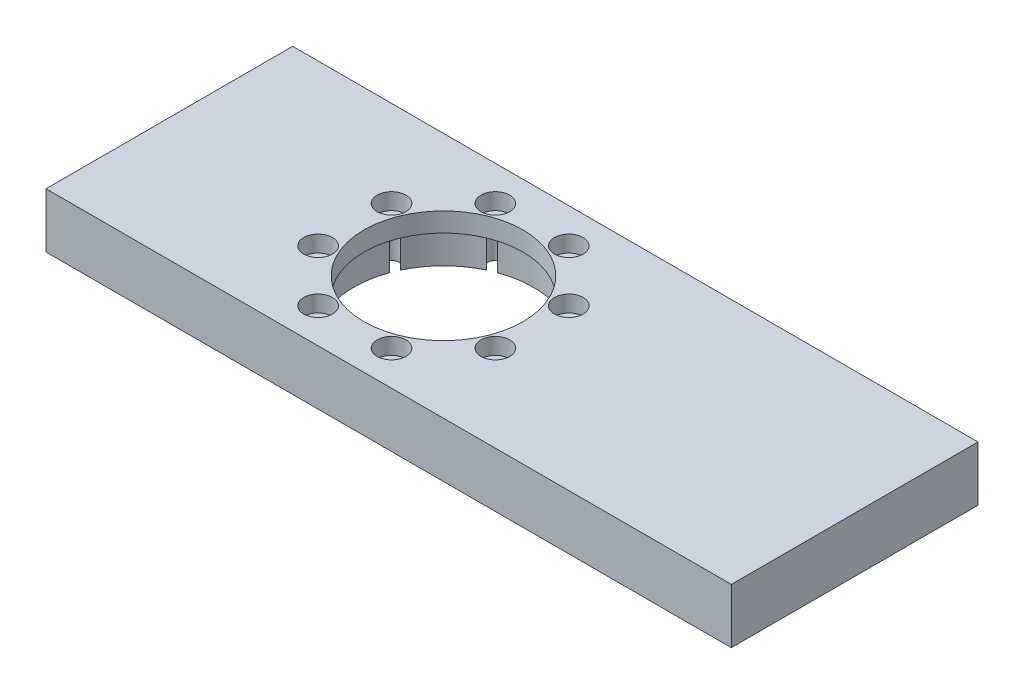
ISO-10303-21;
HEADER;
FILE_DESCRIPTION(('STEP AP214'),'2;1');
FILE_NAME('part.step','',(''),(''),'','','');
FILE_SCHEMA(('AUTOMOTIVE_DESIGN { 1 0 10303 214 1 1 1 1 }'));
ENDSEC;
DATA;
#1=APPLICATION_CONTEXT('core data for automotive mechanical design processes');
#2=APPLICATION_PROTOCOL_DEFINITION('international standard','automotive_design',2000,#1);
#3=PRODUCT_CONTEXT('',#1,'mechanical');
#4=PRODUCT('Part','Part','',(#3));
#5=PRODUCT_RELATED_PRODUCT_CATEGORY('part','',(#4));
#6=PRODUCT_DEFINITION_FORMATION('','',#4);
#7=PRODUCT_DEFINITION_CONTEXT('part definition',#1,'design');
#8=PRODUCT_DEFINITION('design','',#6,#7);
#9=PRODUCT_DEFINITION_SHAPE('','',#8);
#10=(LENGTH_UNIT() NAMED_UNIT(*) SI_UNIT(.MILLI.,.METRE.));
#11=(NAMED_UNIT(*) PLANE_ANGLE_UNIT() SI_UNIT($,.RADIAN.));
#12=(NAMED_UNIT(*) SI_UNIT($,.STERADIAN.) SOLID_ANGLE_UNIT());
#13=UNCERTAINTY_MEASURE_WITH_UNIT(LENGTH_MEASURE(1.E-05),#10,'distance_accuracy_value','');
#14=(GEOMETRIC_REPRESENTATION_CONTEXT(3) GLOBAL_UNCERTAINTY_ASSIGNED_CONTEXT((#13)) GLOBAL_UNIT_ASSIGNED_CONTEXT((#10,
#11,#12)) REPRESENTATION_CONTEXT('',''));
#15=CARTESIAN_POINT('',(0.,0.,0.));
#16=DIRECTION('',(0.,0.,1.));
#17=DIRECTION('',(1.,0.,0.));
#18=AXIS2_PLACEMENT_3D('',#15,#16,#17);
#19=CARTESIAN_POINT('',(-32.3357836378951,20.,13.3939201327779));
#20=DIRECTION('',(0.,1.,0.));
#21=DIRECTION('',(0.,0.,1.));
#22=AXIS2_PLACEMENT_3D('',#19,#20,#21);
#23=CYLINDRICAL_SURFACE('',#22,2.75);
#24=CARTESIAN_POINT('',(-32.3357836378951,14.,13.3939201327779));
#25=DIRECTION('',(0.,1.,0.));
#26=DIRECTION('',(0.,0.,1.));
#27=AXIS2_PLACEMENT_3D('',#24,#25,#26);
#28=CIRCLE('',#27,2.75000000000001);
#29=CARTESIAN_POINT('',(-32.3357836378951,14.,16.143920132778));
#30=VERTEX_POINT('',#29);
#31=EDGE_CURVE('E248',#30,#30,#28,.T.);
#32=ORIENTED_EDGE('',*,*,#31,.T.);
#33=EDGE_LOOP('',(#32));
#34=FACE_BOUND('',#33,.T.);
#35=DIRECTION('',(0.,-1.,0.));
#36=VECTOR('',#35,1.);
#37=CARTESIAN_POINT('',(-30.8092031343509,6.5,11.1065522204826));
#38=LINE('',#37,#36);
#39=CARTESIAN_POINT('',(-30.8092031343509,13.,11.1065522204826));
#40=VERTEX_POINT('',#39);
#41=CARTESIAN_POINT('',(-30.8092031343509,0.,11.1065522204826));
#42=VERTEX_POINT('',#41);
#43=EDGE_CURVE('E395',#40,#42,#38,.T.);
#44=ORIENTED_EDGE('',*,*,#43,.F.);
#45=CARTESIAN_POINT('',(-32.3357836378951,13.,13.3939201327779));
#46=DIRECTION('',(0.,1.,0.));
#47=DIRECTION('',(0.,0.,1.));
#48=AXIS2_PLACEMENT_3D('',#45,#46,#47);
#49=CIRCLE('',#48,2.75);
#50=CARTESIAN_POINT('',(-29.6389148499592,13.,13.9318780685472));
#51=VERTEX_POINT('',#50);
#52=EDGE_CURVE('E354',#40,#51,#49,.F.);
#53=ORIENTED_EDGE('',*,*,#52,.T.);
#54=DIRECTION('',(0.,-1.,0.));
#55=VECTOR('',#54,1.);
#56=CARTESIAN_POINT('',(-29.6389148499592,6.5,13.9318780685472));
#57=LINE('',#56,#55);
#58=CARTESIAN_POINT('',(-29.6389148499592,0.,13.9318780685472));
#59=VERTEX_POINT('',#58);
#60=EDGE_CURVE('E392',#59,#51,#57,.F.);
#61=ORIENTED_EDGE('',*,*,#60,.F.);
#62=CARTESIAN_POINT('',(-32.3357836378951,0.,13.3939201327779));
#63=DIRECTION('',(0.,1.,0.));
#64=DIRECTION('',(0.,0.,1.));
#65=AXIS2_PLACEMENT_3D('',#62,#63,#64);
#66=CIRCLE('',#65,2.75);
#67=EDGE_CURVE('E252',#42,#59,#66,.T.);
#68=ORIENTED_EDGE('',*,*,#67,.F.);
#69=EDGE_LOOP('',(#44,#53,#61,#68));
#70=FACE_BOUND('',#69,.T.);
#71=ADVANCED_FACE('F39',(#34,#70),#23,.F.);
#72=CARTESIAN_POINT('',(-13.3939201327785,20.,32.3357836378946));
#73=DIRECTION('',(0.,1.,0.));
#74=DIRECTION('',(0.,0.,1.));
#75=AXIS2_PLACEMENT_3D('',#72,#73,#74);
#76=CYLINDRICAL_SURFACE('',#75,2.75);
#77=CARTESIAN_POINT('',(-13.3939201327785,14.,32.3357836378946));
#78=DIRECTION('',(0.,1.,0.));
#79=DIRECTION('',(0.,0.,1.));
#80=AXIS2_PLACEMENT_3D('',#77,#78,#79);
#81=CIRCLE('',#80,2.75000000000001);
#82=CARTESIAN_POINT('',(-13.3939201327785,14.,35.0857836378946));
#83=VERTEX_POINT('',#82);
#84=EDGE_CURVE('E234',#83,#83,#81,.T.);
#85=ORIENTED_EDGE('',*,*,#84,.T.);
#86=EDGE_LOOP('',(#85));
#87=FACE_BOUND('',#86,.T.);
#88=DIRECTION('',(0.,-1.,0.));
#89=VECTOR('',#88,1.);
#90=CARTESIAN_POINT('',(-13.9318780685483,6.5,29.6389148499588));
#91=LINE('',#90,#89);
#92=CARTESIAN_POINT('',(-13.9318780685483,13.,29.6389148499588));
#93=VERTEX_POINT('',#92);
#94=CARTESIAN_POINT('',(-13.9318780685483,0.,29.6389148499588));
#95=VERTEX_POINT('',#94);
#96=EDGE_CURVE('E389',#93,#95,#91,.T.);
#97=ORIENTED_EDGE('',*,*,#96,.F.);
#98=CARTESIAN_POINT('',(-13.3939201327785,13.,32.3357836378946));
#99=DIRECTION('',(0.,1.,0.));
#100=DIRECTION('',(0.,0.,1.));
#101=AXIS2_PLACEMENT_3D('',#98,#99,#100);
#102=CIRCLE('',#101,2.75);
#103=CARTESIAN_POINT('',(-11.1065522204828,13.,30.8092031343508));
#104=VERTEX_POINT('',#103);
#105=EDGE_CURVE('E350',#93,#104,#102,.F.);
#106=ORIENTED_EDGE('',*,*,#105,.T.);
#107=DIRECTION('',(0.,-1.,0.));
#108=VECTOR('',#107,1.);
#109=CARTESIAN_POINT('',(-11.1065522204828,6.5,30.8092031343508));
#110=LINE('',#109,#108);
#111=CARTESIAN_POINT('',(-11.1065522204828,0.,30.8092031343508));
#112=VERTEX_POINT('',#111);
#113=EDGE_CURVE('E197',#112,#104,#110,.F.);
#114=ORIENTED_EDGE('',*,*,#113,.F.);
#115=CARTESIAN_POINT('',(-13.3939201327785,0.,32.3357836378946));
#116=DIRECTION('',(0.,1.,0.));
#117=DIRECTION('',(0.,0.,1.));
#118=AXIS2_PLACEMENT_3D('',#115,#116,#117);
#119=CIRCLE('',#118,2.75);
#120=EDGE_CURVE('E210',#95,#112,#119,.T.);
#121=ORIENTED_EDGE('',*,*,#120,.F.);
#122=EDGE_LOOP('',(#97,#106,#114,#121));
#123=FACE_BOUND('',#122,.T.);
#124=ADVANCED_FACE('F524',(#87,#123),#76,.F.);
#125=CARTESIAN_POINT('',(13.3939201327774,20.,32.3357836378946));
#126=DIRECTION('',(0.,1.,0.));
#127=DIRECTION('',(0.,0.,1.));
#128=AXIS2_PLACEMENT_3D('',#125,#126,#127);
#129=CYLINDRICAL_SURFACE('',#128,2.75);
#130=CARTESIAN_POINT('',(13.3939201327774,14.,32.3357836378946));
#131=DIRECTION('',(0.,1.,0.));
#132=DIRECTION('',(0.,0.,1.));
#133=AXIS2_PLACEMENT_3D('',#130,#131,#132);
#134=CIRCLE('',#133,2.75000000000001);
#135=CARTESIAN_POINT('',(13.3939201327774,14.,35.0857836378946));
#136=VERTEX_POINT('',#135);
#137=EDGE_CURVE('E219',#136,#136,#134,.T.);
#138=ORIENTED_EDGE('',*,*,#137,.T.);
#139=EDGE_LOOP('',(#138));
#140=FACE_BOUND('',#139,.T.);
#141=DIRECTION('',(0.,-1.,0.));
#142=VECTOR('',#141,1.);
#143=CARTESIAN_POINT('',(11.1065522204813,6.5,30.8092031343513));
#144=LINE('',#143,#142);
#145=CARTESIAN_POINT('',(11.1065522204814,13.,30.8092031343513));
#146=VERTEX_POINT('',#145);
#147=CARTESIAN_POINT('',(11.1065522204814,0.,30.8092031343513));
#148=VERTEX_POINT('',#147);
#149=EDGE_CURVE('E186',#146,#148,#144,.T.);
#150=ORIENTED_EDGE('',*,*,#149,.F.);
#151=CARTESIAN_POINT('',(13.3939201327774,13.,32.3357836378946));
#152=DIRECTION('',(0.,1.,0.));
#153=DIRECTION('',(0.,0.,1.));
#154=AXIS2_PLACEMENT_3D('',#151,#152,#153);
#155=CIRCLE('',#154,2.75);
#156=CARTESIAN_POINT('',(13.9318780685479,13.,29.6389148499589));
#157=VERTEX_POINT('',#156);
#158=EDGE_CURVE('E347',#146,#157,#155,.F.);
#159=ORIENTED_EDGE('',*,*,#158,.T.);
#160=DIRECTION('',(0.,-1.,0.));
#161=VECTOR('',#160,1.);
#162=CARTESIAN_POINT('',(13.9318780685479,6.5,29.6389148499589));
#163=LINE('',#162,#161);
#164=CARTESIAN_POINT('',(13.9318780685479,0.,29.6389148499589));
#165=VERTEX_POINT('',#164);
#166=EDGE_CURVE('E198',#165,#157,#163,.F.);
#167=ORIENTED_EDGE('',*,*,#166,.F.);
#168=CARTESIAN_POINT('',(13.3939201327774,0.,32.3357836378946));
#169=DIRECTION('',(0.,1.,0.));
#170=DIRECTION('',(0.,0.,1.));
#171=AXIS2_PLACEMENT_3D('',#168,#169,#170);
#172=CIRCLE('',#171,2.75);
#173=EDGE_CURVE('E207',#148,#165,#172,.T.);
#174=ORIENTED_EDGE('',*,*,#173,.F.);
#175=EDGE_LOOP('',(#150,#159,#167,#174));
#176=FACE_BOUND('',#175,.T.);
#177=ADVANCED_FACE('F216',(#140,#176),#129,.F.);
#178=CARTESIAN_POINT('',(32.335783637894,20.,13.3939201327779));
#179=DIRECTION('',(0.,1.,0.));
#180=DIRECTION('',(0.,0.,1.));
#181=AXIS2_PLACEMENT_3D('',#178,#179,#180);
#182=CYLINDRICAL_SURFACE('',#181,2.75);
#183=CARTESIAN_POINT('',(32.335783637894,14.,13.3939201327779));
#184=DIRECTION('',(0.,1.,0.));
#185=DIRECTION('',(0.,0.,1.));
#186=AXIS2_PLACEMENT_3D('',#183,#184,#185);
#187=CIRCLE('',#186,2.75000000000001);
#188=CARTESIAN_POINT('',(32.335783637894,14.,16.143920132778));
#189=VERTEX_POINT('',#188);
#190=EDGE_CURVE('E468',#189,#189,#187,.T.);
#191=ORIENTED_EDGE('',*,*,#190,.T.);
#192=EDGE_LOOP('',(#191));
#193=FACE_BOUND('',#192,.T.);
#194=DIRECTION('',(0.,-1.,0.));
#195=VECTOR('',#194,1.);
#196=CARTESIAN_POINT('',(29.6389148499584,6.5,13.9318780685489));
#197=LINE('',#196,#195);
#198=CARTESIAN_POINT('',(29.6389148499584,13.,13.9318780685489));
#199=VERTEX_POINT('',#198);
#200=CARTESIAN_POINT('',(29.6389148499584,0.,13.9318780685489));
#201=VERTEX_POINT('',#200);
#202=EDGE_CURVE('E382',#199,#201,#197,.T.);
#203=ORIENTED_EDGE('',*,*,#202,.F.);
#204=CARTESIAN_POINT('',(32.335783637894,13.,13.3939201327779));
#205=DIRECTION('',(0.,1.,0.));
#206=DIRECTION('',(0.,0.,1.));
#207=AXIS2_PLACEMENT_3D('',#204,#205,#206);
#208=CIRCLE('',#207,2.75);
#209=CARTESIAN_POINT('',(30.8092031343512,13.,11.1065522204815));
#210=VERTEX_POINT('',#209);
#211=EDGE_CURVE('E343',#199,#210,#208,.F.);
#212=ORIENTED_EDGE('',*,*,#211,.T.);
#213=DIRECTION('',(0.,-1.,0.));
#214=VECTOR('',#213,1.);
#215=CARTESIAN_POINT('',(30.8092031343512,6.5,11.1065522204816));
#216=LINE('',#215,#214);
#217=CARTESIAN_POINT('',(30.8092031343512,0.,11.1065522204815));
#218=VERTEX_POINT('',#217);
#219=EDGE_CURVE('E379',#218,#210,#216,.F.);
#220=ORIENTED_EDGE('',*,*,#219,.F.);
#221=CARTESIAN_POINT('',(32.335783637894,0.,13.3939201327779));
#222=DIRECTION('',(0.,1.,0.));
#223=DIRECTION('',(0.,0.,1.));
#224=AXIS2_PLACEMENT_3D('',#221,#222,#223);
#225=CIRCLE('',#224,2.75);
#226=EDGE_CURVE('E472',#201,#218,#225,.T.);
#227=ORIENTED_EDGE('',*,*,#226,.F.);
#228=EDGE_LOOP('',(#203,#212,#220,#227));
#229=FACE_BOUND('',#228,.T.);
#230=ADVANCED_FACE('F551',(#193,#229),#182,.F.);
#231=CARTESIAN_POINT('',(32.335783637894,20.,-13.3939201327779));
#232=DIRECTION('',(0.,1.,0.));
#233=DIRECTION('',(0.,0.,1.));
#234=AXIS2_PLACEMENT_3D('',#231,#232,#233);
#235=CYLINDRICAL_SURFACE('',#234,2.75);
#236=CARTESIAN_POINT('',(32.335783637894,14.,-13.3939201327779));
#237=DIRECTION('',(0.,1.,0.));
#238=DIRECTION('',(0.,0.,1.));
#239=AXIS2_PLACEMENT_3D('',#236,#237,#238);
#240=CIRCLE('',#239,2.75000000000001);
#241=CARTESIAN_POINT('',(32.335783637894,14.,-10.6439201327779));
#242=VERTEX_POINT('',#241);
#243=EDGE_CURVE('E452',#242,#242,#240,.T.);
#244=ORIENTED_EDGE('',*,*,#243,.T.);
#245=EDGE_LOOP('',(#244));
#246=FACE_BOUND('',#245,.T.);
#247=DIRECTION('',(0.,-1.,0.));
#248=VECTOR('',#247,1.);
#249=CARTESIAN_POINT('',(30.8092031343512,6.5,-11.1065522204816));
#250=LINE('',#249,#248);
#251=CARTESIAN_POINT('',(30.8092031343512,13.,-11.1065522204815));
#252=VERTEX_POINT('',#251);
#253=CARTESIAN_POINT('',(30.8092031343512,0.,-11.1065522204815));
#254=VERTEX_POINT('',#253);
#255=EDGE_CURVE('E376',#252,#254,#250,.T.);
#256=ORIENTED_EDGE('',*,*,#255,.F.);
#257=CARTESIAN_POINT('',(32.335783637894,13.,-13.3939201327779));
#258=DIRECTION('',(0.,1.,0.));
#259=DIRECTION('',(0.,0.,1.));
#260=AXIS2_PLACEMENT_3D('',#257,#258,#259);
#261=CIRCLE('',#260,2.75);
#262=CARTESIAN_POINT('',(29.6389148499584,13.,-13.931878068549));
#263=VERTEX_POINT('',#262);
#264=EDGE_CURVE('E339',#252,#263,#261,.F.);
#265=ORIENTED_EDGE('',*,*,#264,.T.);
#266=DIRECTION('',(0.,-1.,0.));
#267=VECTOR('',#266,1.);
#268=CARTESIAN_POINT('',(29.6389148499584,6.5,-13.9318780685489));
#269=LINE('',#268,#267);
#270=CARTESIAN_POINT('',(29.6389148499584,0.,-13.931878068549));
#271=VERTEX_POINT('',#270);
#272=EDGE_CURVE('E373',#271,#263,#269,.F.);
#273=ORIENTED_EDGE('',*,*,#272,.F.);
#274=CARTESIAN_POINT('',(32.335783637894,0.,-13.3939201327779));
#275=DIRECTION('',(0.,1.,0.));
#276=DIRECTION('',(0.,0.,1.));
#277=AXIS2_PLACEMENT_3D('',#274,#275,#276);
#278=CIRCLE('',#277,2.75);
#279=EDGE_CURVE('E456',#254,#271,#278,.T.);
#280=ORIENTED_EDGE('',*,*,#279,.F.);
#281=EDGE_LOOP('',(#256,#265,#273,#280));
#282=FACE_BOUND('',#281,.T.);
#283=ADVANCED_FACE('F558',(#246,#282),#235,.F.);
#284=CARTESIAN_POINT('',(13.3939201327774,20.,-32.3357836378946));
#285=DIRECTION('',(0.,1.,0.));
#286=DIRECTION('',(0.,0.,1.));
#287=AXIS2_PLACEMENT_3D('',#284,#285,#286);
#288=CYLINDRICAL_SURFACE('',#287,2.75);
#289=CARTESIAN_POINT('',(13.3939201327774,14.,-32.3357836378946));
#290=DIRECTION('',(0.,1.,0.));
#291=DIRECTION('',(0.,0.,1.));
#292=AXIS2_PLACEMENT_3D('',#289,#290,#291);
#293=CIRCLE('',#292,2.75000000000001);
#294=CARTESIAN_POINT('',(13.3939201327774,14.,-29.5857836378946));
#295=VERTEX_POINT('',#294);
#296=EDGE_CURVE('E436',#295,#295,#293,.T.);
#297=ORIENTED_EDGE('',*,*,#296,.T.);
#298=EDGE_LOOP('',(#297));
#299=FACE_BOUND('',#298,.T.);
#300=DIRECTION('',(0.,-1.,0.));
#301=VECTOR('',#300,1.);
#302=CARTESIAN_POINT('',(13.9318780685479,6.5,-29.6389148499589));
#303=LINE('',#302,#301);
#304=CARTESIAN_POINT('',(13.9318780685479,13.,-29.6389148499589));
#305=VERTEX_POINT('',#304);
#306=CARTESIAN_POINT('',(13.9318780685479,0.,-29.6389148499589));
#307=VERTEX_POINT('',#306);
#308=EDGE_CURVE('E370',#305,#307,#303,.T.);
#309=ORIENTED_EDGE('',*,*,#308,.F.);
#310=CARTESIAN_POINT('',(13.3939201327774,13.,-32.3357836378946));
#311=DIRECTION('',(0.,1.,0.));
#312=DIRECTION('',(0.,0.,1.));
#313=AXIS2_PLACEMENT_3D('',#310,#311,#312);
#314=CIRCLE('',#313,2.75);
#315=CARTESIAN_POINT('',(11.1065522204814,13.,-30.8092031343513));
#316=VERTEX_POINT('',#315);
#317=EDGE_CURVE('E335',#305,#316,#314,.F.);
#318=ORIENTED_EDGE('',*,*,#317,.T.);
#319=DIRECTION('',(0.,-1.,0.));
#320=VECTOR('',#319,1.);
#321=CARTESIAN_POINT('',(11.1065522204813,6.5,-30.8092031343513));
#322=LINE('',#321,#320);
#323=CARTESIAN_POINT('',(11.1065522204814,0.,-30.8092031343513));
#324=VERTEX_POINT('',#323);
#325=EDGE_CURVE('E367',#324,#316,#322,.F.);
#326=ORIENTED_EDGE('',*,*,#325,.F.);
#327=CARTESIAN_POINT('',(13.3939201327774,0.,-32.3357836378946));
#328=DIRECTION('',(0.,1.,0.));
#329=DIRECTION('',(0.,0.,1.));
#330=AXIS2_PLACEMENT_3D('',#327,#328,#329);
#331=CIRCLE('',#330,2.75);
#332=EDGE_CURVE('E440',#307,#324,#331,.T.);
#333=ORIENTED_EDGE('',*,*,#332,.F.);
#334=EDGE_LOOP('',(#309,#318,#326,#333));
#335=FACE_BOUND('',#334,.T.);
#336=ADVANCED_FACE('F570',(#299,#335),#288,.F.);
#337=CARTESIAN_POINT('',(-13.3939201327785,20.,-32.3357836378946));
#338=DIRECTION('',(0.,1.,0.));
#339=DIRECTION('',(0.,0.,1.));
#340=AXIS2_PLACEMENT_3D('',#337,#338,#339);
#341=CYLINDRICAL_SURFACE('',#340,2.75);
#342=CARTESIAN_POINT('',(-13.3939201327785,14.,-32.3357836378946));
#343=DIRECTION('',(0.,1.,0.));
#344=DIRECTION('',(0.,0.,1.));
#345=AXIS2_PLACEMENT_3D('',#342,#343,#344);
#346=CIRCLE('',#345,2.75000000000001);
#347=CARTESIAN_POINT('',(-13.3939201327785,14.,-29.5857836378946));
#348=VERTEX_POINT('',#347);
#349=EDGE_CURVE('E421',#348,#348,#346,.T.);
#350=ORIENTED_EDGE('',*,*,#349,.T.);
#351=EDGE_LOOP('',(#350));
#352=FACE_BOUND('',#351,.T.);
#353=DIRECTION('',(0.,-1.,0.));
#354=VECTOR('',#353,1.);
#355=CARTESIAN_POINT('',(-11.1065522204828,6.5,-30.8092031343508));
#356=LINE('',#355,#354);
#357=CARTESIAN_POINT('',(-11.1065522204828,13.,-30.8092031343508));
#358=VERTEX_POINT('',#357);
#359=CARTESIAN_POINT('',(-11.1065522204828,0.,-30.8092031343508));
#360=VERTEX_POINT('',#359);
#361=EDGE_CURVE('E364',#358,#360,#356,.T.);
#362=ORIENTED_EDGE('',*,*,#361,.F.);
#363=CARTESIAN_POINT('',(-13.3939201327785,13.,-32.3357836378946));
#364=DIRECTION('',(0.,1.,0.));
#365=DIRECTION('',(0.,0.,1.));
#366=AXIS2_PLACEMENT_3D('',#363,#364,#365);
#367=CIRCLE('',#366,2.75);
#368=CARTESIAN_POINT('',(-13.9318780685482,13.,-29.6389148499588));
#369=VERTEX_POINT('',#368);
#370=EDGE_CURVE('E332',#358,#369,#367,.F.);
#371=ORIENTED_EDGE('',*,*,#370,.T.);
#372=DIRECTION('',(0.,-1.,0.));
#373=VECTOR('',#372,1.);
#374=CARTESIAN_POINT('',(-13.9318780685483,6.5,-29.6389148499588));
#375=LINE('',#374,#373);
#376=CARTESIAN_POINT('',(-13.9318780685482,0.,-29.6389148499588));
#377=VERTEX_POINT('',#376);
#378=EDGE_CURVE('E320',#377,#369,#375,.F.);
#379=ORIENTED_EDGE('',*,*,#378,.F.);
#380=CARTESIAN_POINT('',(-13.3939201327785,0.,-32.3357836378946));
#381=DIRECTION('',(0.,1.,0.));
#382=DIRECTION('',(0.,0.,1.));
#383=AXIS2_PLACEMENT_3D('',#380,#381,#382);
#384=CIRCLE('',#383,2.75);
#385=EDGE_CURVE('E425',#360,#377,#384,.T.);
#386=ORIENTED_EDGE('',*,*,#385,.F.);
#387=EDGE_LOOP('',(#362,#371,#379,#386));
#388=FACE_BOUND('',#387,.T.);
#389=ADVANCED_FACE('F582',(#352,#388),#341,.F.);
#390=CARTESIAN_POINT('',(-32.3357836378951,20.,-13.3939201327779));
#391=DIRECTION('',(0.,1.,0.));
#392=DIRECTION('',(0.,0.,1.));
#393=AXIS2_PLACEMENT_3D('',#390,#391,#392);
#394=CYLINDRICAL_SURFACE('',#393,2.75);
#395=CARTESIAN_POINT('',(-32.3357836378951,14.,-13.3939201327779));
#396=DIRECTION('',(0.,1.,0.));
#397=DIRECTION('',(0.,0.,1.));
#398=AXIS2_PLACEMENT_3D('',#395,#396,#397);
#399=CIRCLE('',#398,2.75000000000001);
#400=CARTESIAN_POINT('',(-32.3357836378951,14.,-10.6439201327779));
#401=VERTEX_POINT('',#400);
#402=EDGE_CURVE('E406',#401,#401,#399,.T.);
#403=ORIENTED_EDGE('',*,*,#402,.T.);
#404=EDGE_LOOP('',(#403));
#405=FACE_BOUND('',#404,.T.);
#406=DIRECTION('',(0.,-1.,0.));
#407=VECTOR('',#406,1.);
#408=CARTESIAN_POINT('',(-29.6389148499592,6.5,-13.9318780685472));
#409=LINE('',#408,#407);
#410=CARTESIAN_POINT('',(-29.6389148499592,13.,-13.9318780685472));
#411=VERTEX_POINT('',#410);
#412=CARTESIAN_POINT('',(-29.6389148499592,0.,-13.9318780685472));
#413=VERTEX_POINT('',#412);
#414=EDGE_CURVE('E11',#411,#413,#409,.T.);
#415=ORIENTED_EDGE('',*,*,#414,.F.);
#416=CARTESIAN_POINT('',(-32.3357836378951,13.,-13.3939201327779));
#417=DIRECTION('',(0.,1.,0.));
#418=DIRECTION('',(0.,0.,1.));
#419=AXIS2_PLACEMENT_3D('',#416,#417,#418);
#420=CIRCLE('',#419,2.75);
#421=CARTESIAN_POINT('',(-30.8092031343509,13.,-11.1065522204826));
#422=VERTEX_POINT('',#421);
#423=EDGE_CURVE('E295',#411,#422,#420,.F.);
#424=ORIENTED_EDGE('',*,*,#423,.T.);
#425=DIRECTION('',(0.,-1.,0.));
#426=VECTOR('',#425,1.);
#427=CARTESIAN_POINT('',(-30.8092031343509,6.5,-11.1065522204826));
#428=LINE('',#427,#426);
#429=CARTESIAN_POINT('',(-30.8092031343509,0.,-11.1065522204826));
#430=VERTEX_POINT('',#429);
#431=EDGE_CURVE('E48',#430,#422,#428,.F.);
#432=ORIENTED_EDGE('',*,*,#431,.F.);
#433=CARTESIAN_POINT('',(-32.3357836378951,0.,-13.3939201327779));
#434=DIRECTION('',(0.,1.,0.));
#435=DIRECTION('',(0.,0.,1.));
#436=AXIS2_PLACEMENT_3D('',#433,#434,#435);
#437=CIRCLE('',#436,2.75);
#438=EDGE_CURVE('E410',#413,#430,#437,.T.);
#439=ORIENTED_EDGE('',*,*,#438,.F.);
#440=EDGE_LOOP('',(#415,#424,#432,#439));
#441=FACE_BOUND('',#440,.T.);
#442=ADVANCED_FACE('F309',(#405,#441),#394,.F.);
#443=CARTESIAN_POINT('',(150.,20.,45.));
#444=DIRECTION('',(-1.,0.,0.));
#445=DIRECTION('',(0.,0.,1.));
#446=AXIS2_PLACEMENT_3D('',#443,#444,#445);
#447=PLANE('',#446);
#448=DIRECTION('',(0.,0.,-1.));
#449=VECTOR('',#448,1.);
#450=CARTESIAN_POINT('',(150.,0.,45.));
#451=LINE('',#450,#449);
#452=CARTESIAN_POINT('',(150.,0.,45.));
#453=VERTEX_POINT('',#452);
#454=CARTESIAN_POINT('',(150.,0.,-45.));
#455=VERTEX_POINT('',#454);
#456=EDGE_CURVE('E260',#453,#455,#451,.T.);
#457=ORIENTED_EDGE('',*,*,#456,.T.);
#458=DIRECTION('',(0.,-1.,0.));
#459=VECTOR('',#458,1.);
#460=CARTESIAN_POINT('',(150.,20.,-45.));
#461=LINE('',#460,#459);
#462=CARTESIAN_POINT('',(150.,20.,-45.));
#463=VERTEX_POINT('',#462);
#464=EDGE_CURVE('E292',#463,#455,#461,.T.);
#465=ORIENTED_EDGE('',*,*,#464,.F.);
#466=DIRECTION('',(0.,0.,-1.));
#467=VECTOR('',#466,1.);
#468=CARTESIAN_POINT('',(150.,20.,45.));
#469=LINE('',#468,#467);
#470=CARTESIAN_POINT('',(150.,20.,45.));
#471=VERTEX_POINT('',#470);
#472=EDGE_CURVE('E261',#471,#463,#469,.T.);
#473=ORIENTED_EDGE('',*,*,#472,.F.);
#474=DIRECTION('',(0.,-1.,0.));
#475=VECTOR('',#474,1.);
#476=CARTESIAN_POINT('',(150.,20.,45.));
#477=LINE('',#476,#475);
#478=EDGE_CURVE('E271',#471,#453,#477,.T.);
#479=ORIENTED_EDGE('',*,*,#478,.T.);
#480=EDGE_LOOP('',(#457,#465,#473,#479));
#481=FACE_BOUND('',#480,.T.);
#482=ADVANCED_FACE('F41',(#481),#447,.F.);
#483=CARTESIAN_POINT('',(-100.,20.,-45.));
#484=DIRECTION('',(0.,0.,1.));
#485=DIRECTION('',(1.,0.,0.));
#486=AXIS2_PLACEMENT_3D('',#483,#484,#485);
#487=PLANE('',#486);
#488=DIRECTION('',(-1.,0.,0.));
#489=VECTOR('',#488,1.);
#490=CARTESIAN_POINT('',(-100.,0.,-45.));
#491=LINE('',#490,#489);
#492=CARTESIAN_POINT('',(-100.,0.,-45.));
#493=VERTEX_POINT('',#492);
#494=EDGE_CURVE('E275',#455,#493,#491,.T.);
#495=ORIENTED_EDGE('',*,*,#494,.T.);
#496=DIRECTION('',(0.,-1.,0.));
#497=VECTOR('',#496,1.);
#498=CARTESIAN_POINT('',(-100.,20.,-45.));
#499=LINE('',#498,#497);
#500=CARTESIAN_POINT('',(-100.,20.,-45.));
#501=VERTEX_POINT('',#500);
#502=EDGE_CURVE('E288',#501,#493,#499,.T.);
#503=ORIENTED_EDGE('',*,*,#502,.F.);
#504=DIRECTION('',(-1.,0.,0.));
#505=VECTOR('',#504,1.);
#506=CARTESIAN_POINT('',(-100.,20.,-45.));
#507=LINE('',#506,#505);
#508=EDGE_CURVE('E93',#463,#501,#507,.T.);
#509=ORIENTED_EDGE('',*,*,#508,.F.);
#510=ORIENTED_EDGE('',*,*,#464,.T.);
#511=EDGE_LOOP('',(#495,#503,#509,#510));
#512=FACE_BOUND('',#511,.T.);
#513=ADVANCED_FACE('F507',(#512),#487,.F.);
#514=CARTESIAN_POINT('',(-100.,20.,45.));
#515=DIRECTION('',(1.,0.,0.));
#516=DIRECTION('',(0.,0.,-1.));
#517=AXIS2_PLACEMENT_3D('',#514,#515,#516);
#518=PLANE('',#517);
#519=DIRECTION('',(0.,0.,1.));
#520=VECTOR('',#519,1.);
#521=CARTESIAN_POINT('',(-100.,0.,45.));
#522=LINE('',#521,#520);
#523=CARTESIAN_POINT('',(-100.,0.,45.));
#524=VERTEX_POINT('',#523);
#525=EDGE_CURVE('E278',#493,#524,#522,.T.);
#526=ORIENTED_EDGE('',*,*,#525,.T.);
#527=DIRECTION('',(0.,-1.,0.));
#528=VECTOR('',#527,1.);
#529=CARTESIAN_POINT('',(-100.,20.,45.));
#530=LINE('',#529,#528);
#531=CARTESIAN_POINT('',(-100.,20.,45.));
#532=VERTEX_POINT('',#531);
#533=EDGE_CURVE('E285',#532,#524,#530,.T.);
#534=ORIENTED_EDGE('',*,*,#533,.F.);
#535=DIRECTION('',(0.,0.,1.));
#536=VECTOR('',#535,1.);
#537=CARTESIAN_POINT('',(-100.,20.,45.));
#538=LINE('',#537,#536);
#539=EDGE_CURVE('E266',#501,#532,#538,.T.);
#540=ORIENTED_EDGE('',*,*,#539,.F.);
#541=ORIENTED_EDGE('',*,*,#502,.T.);
#542=EDGE_LOOP('',(#526,#534,#540,#541));
#543=FACE_BOUND('',#542,.T.);
#544=ADVANCED_FACE('F511',(#543),#518,.F.);
#545=CARTESIAN_POINT('',(-100.,20.,45.));
#546=DIRECTION('',(0.,0.,-1.));
#547=DIRECTION('',(-1.,0.,0.));
#548=AXIS2_PLACEMENT_3D('',#545,#546,#547);
#549=PLANE('',#548);
#550=DIRECTION('',(1.,0.,0.));
#551=VECTOR('',#550,1.);
#552=CARTESIAN_POINT('',(-100.,0.,45.));
#553=LINE('',#552,#551);
#554=EDGE_CURVE('E85',#524,#453,#553,.T.);
#555=ORIENTED_EDGE('',*,*,#554,.T.);
#556=ORIENTED_EDGE('',*,*,#478,.F.);
#557=DIRECTION('',(1.,0.,0.));
#558=VECTOR('',#557,1.);
#559=CARTESIAN_POINT('',(-100.,20.,45.));
#560=LINE('',#559,#558);
#561=EDGE_CURVE('E64',#532,#471,#560,.T.);
#562=ORIENTED_EDGE('',*,*,#561,.F.);
#563=ORIENTED_EDGE('',*,*,#533,.T.);
#564=EDGE_LOOP('',(#555,#556,#562,#563));
#565=FACE_BOUND('',#564,.T.);
#566=ADVANCED_FACE('F495',(#565),#549,.F.);
#567=CARTESIAN_POINT('',(0.,20.,0.));
#568=DIRECTION('',(0.,-1.,0.));
#569=DIRECTION('',(0.,0.,-1.));
#570=AXIS2_PLACEMENT_3D('',#567,#568,#569);
#571=PLANE('',#570);
#572=CARTESIAN_POINT('',(-32.3357836378951,20.,-13.3939201327779));
#573=DIRECTION('',(0.,1.,0.));
#574=DIRECTION('',(0.,0.,1.));
#575=AXIS2_PLACEMENT_3D('',#572,#573,#574);
#576=CIRCLE('',#575,5.24999999999999);
#577=CARTESIAN_POINT('',(-32.3357836378951,20.,-8.14392013277795));
#578=VERTEX_POINT('',#577);
#579=EDGE_CURVE('E398',#578,#578,#576,.T.);
#580=ORIENTED_EDGE('',*,*,#579,.F.);
#581=EDGE_LOOP('',(#580));
#582=FACE_BOUND('',#581,.T.);
#583=CARTESIAN_POINT('',(-13.3939201327785,20.,-32.3357836378946));
#584=DIRECTION('',(0.,1.,0.));
#585=DIRECTION('',(0.,0.,1.));
#586=AXIS2_PLACEMENT_3D('',#583,#584,#585);
#587=CIRCLE('',#586,5.24999999999999);
#588=CARTESIAN_POINT('',(-13.3939201327785,20.,-27.0857836378946));
#589=VERTEX_POINT('',#588);
#590=EDGE_CURVE('E413',#589,#589,#587,.T.);
#591=ORIENTED_EDGE('',*,*,#590,.F.);
#592=EDGE_LOOP('',(#591));
#593=FACE_BOUND('',#592,.T.);
#594=CARTESIAN_POINT('',(13.3939201327774,20.,-32.3357836378946));
#595=DIRECTION('',(0.,1.,0.));
#596=DIRECTION('',(0.,0.,1.));
#597=AXIS2_PLACEMENT_3D('',#594,#595,#596);
#598=CIRCLE('',#597,5.24999999999999);
#599=CARTESIAN_POINT('',(13.3939201327774,20.,-27.0857836378946));
#600=VERTEX_POINT('',#599);
#601=EDGE_CURVE('E428',#600,#600,#598,.T.);
#602=ORIENTED_EDGE('',*,*,#601,.F.);
#603=EDGE_LOOP('',(#602));
#604=FACE_BOUND('',#603,.T.);
#605=CARTESIAN_POINT('',(32.335783637894,20.,-13.3939201327779));
#606=DIRECTION('',(0.,1.,0.));
#607=DIRECTION('',(0.,0.,1.));
#608=AXIS2_PLACEMENT_3D('',#605,#606,#607);
#609=CIRCLE('',#608,5.25);
#610=CARTESIAN_POINT('',(32.335783637894,20.,-8.14392013277795));
#611=VERTEX_POINT('',#610);
#612=EDGE_CURVE('E444',#611,#611,#609,.T.);
#613=ORIENTED_EDGE('',*,*,#612,.F.);
#614=EDGE_LOOP('',(#613));
#615=FACE_BOUND('',#614,.T.);
#616=CARTESIAN_POINT('',(32.335783637894,20.,13.3939201327779));
#617=DIRECTION('',(0.,1.,0.));
#618=DIRECTION('',(0.,0.,1.));
#619=AXIS2_PLACEMENT_3D('',#616,#617,#618);
#620=CIRCLE('',#619,5.24999999999999);
#621=CARTESIAN_POINT('',(32.335783637894,20.,18.6439201327779));
#622=VERTEX_POINT('',#621);
#623=EDGE_CURVE('E460',#622,#622,#620,.T.);
#624=ORIENTED_EDGE('',*,*,#623,.F.);
#625=EDGE_LOOP('',(#624));
#626=FACE_BOUND('',#625,.T.);
#627=CARTESIAN_POINT('',(13.3939201327774,20.,32.3357836378946));
#628=DIRECTION('',(0.,1.,0.));
#629=DIRECTION('',(0.,0.,1.));
#630=AXIS2_PLACEMENT_3D('',#627,#628,#629);
#631=CIRCLE('',#630,5.24999999999999);
#632=CARTESIAN_POINT('',(13.3939201327774,20.,37.5857836378946));
#633=VERTEX_POINT('',#632);
#634=EDGE_CURVE('E476',#633,#633,#631,.T.);
#635=ORIENTED_EDGE('',*,*,#634,.F.);
#636=EDGE_LOOP('',(#635));
#637=FACE_BOUND('',#636,.T.);
#638=CARTESIAN_POINT('',(-13.3939201327785,20.,32.3357836378946));
#639=DIRECTION('',(0.,1.,0.));
#640=DIRECTION('',(0.,0.,1.));
#641=AXIS2_PLACEMENT_3D('',#638,#639,#640);
#642=CIRCLE('',#641,5.24999999999999);
#643=CARTESIAN_POINT('',(-13.3939201327785,20.,37.5857836378946));
#644=VERTEX_POINT('',#643);
#645=EDGE_CURVE('E218',#644,#644,#642,.T.);
#646=ORIENTED_EDGE('',*,*,#645,.F.);
#647=EDGE_LOOP('',(#646));
#648=FACE_BOUND('',#647,.T.);
#649=CARTESIAN_POINT('',(-32.3357836378951,20.,13.3939201327779));
#650=DIRECTION('',(0.,1.,0.));
#651=DIRECTION('',(0.,0.,1.));
#652=AXIS2_PLACEMENT_3D('',#649,#650,#651);
#653=CIRCLE('',#652,5.24999999999999);
#654=CARTESIAN_POINT('',(-32.3357836378951,20.,18.6439201327779));
#655=VERTEX_POINT('',#654);
#656=EDGE_CURVE('E240',#655,#655,#653,.T.);
#657=ORIENTED_EDGE('',*,*,#656,.F.);
#658=EDGE_LOOP('',(#657));
#659=FACE_BOUND('',#658,.T.);
#660=CARTESIAN_POINT('',(0.,20.,0.));
#661=DIRECTION('',(0.,-1.,0.));
#662=DIRECTION('',(0.,0.,-1.));
#663=AXIS2_PLACEMENT_3D('',#660,#661,#662);
#664=CIRCLE('',#663,29.);
#665=CARTESIAN_POINT('',(0.,20.,-29.));
#666=VERTEX_POINT('',#665);
#667=EDGE_CURVE('E256',#666,#666,#664,.T.);
#668=ORIENTED_EDGE('',*,*,#667,.T.);
#669=EDGE_LOOP('',(#668));
#670=FACE_BOUND('',#669,.T.);
#671=ORIENTED_EDGE('',*,*,#472,.T.);
#672=ORIENTED_EDGE('',*,*,#508,.T.);
#673=ORIENTED_EDGE('',*,*,#539,.T.);
#674=ORIENTED_EDGE('',*,*,#561,.T.);
#675=EDGE_LOOP('',(#671,#672,#673,#674));
#676=FACE_BOUND('',#675,.T.);
#677=ADVANCED_FACE('F492',(#582,#593,#604,#615,#626,#637,#648,#659,#670,#676),#571,.F.);
#678=CARTESIAN_POINT('',(0.,0.,0.));
#679=DIRECTION('',(0.,-1.,0.));
#680=DIRECTION('',(0.,0.,-1.));
#681=AXIS2_PLACEMENT_3D('',#678,#679,#680);
#682=PLANE('',#681);
#683=ORIENTED_EDGE('',*,*,#385,.T.);
#684=CARTESIAN_POINT('',(0.,0.,0.));
#685=DIRECTION('',(0.,1.,0.));
#686=DIRECTION('',(0.,0.,1.));
#687=AXIS2_PLACEMENT_3D('',#684,#685,#686);
#688=CIRCLE('',#687,32.75);
#689=EDGE_CURVE('E650',#377,#413,#688,.T.);
#690=ORIENTED_EDGE('',*,*,#689,.T.);
#691=ORIENTED_EDGE('',*,*,#438,.T.);
#692=EDGE_CURVE('E304',#430,#42,#688,.T.);
#693=ORIENTED_EDGE('',*,*,#692,.T.);
#694=ORIENTED_EDGE('',*,*,#67,.T.);
#695=EDGE_CURVE('E212',#59,#95,#688,.T.);
#696=ORIENTED_EDGE('',*,*,#695,.T.);
#697=ORIENTED_EDGE('',*,*,#120,.T.);
#698=EDGE_CURVE('E189',#112,#148,#688,.T.);
#699=ORIENTED_EDGE('',*,*,#698,.T.);
#700=ORIENTED_EDGE('',*,*,#173,.T.);
#701=EDGE_CURVE('E214',#165,#201,#688,.T.);
#702=ORIENTED_EDGE('',*,*,#701,.T.);
#703=ORIENTED_EDGE('',*,*,#226,.T.);
#704=EDGE_CURVE('E647',#218,#254,#688,.T.);
#705=ORIENTED_EDGE('',*,*,#704,.T.);
#706=ORIENTED_EDGE('',*,*,#279,.T.);
#707=EDGE_CURVE('E642',#271,#307,#688,.T.);
#708=ORIENTED_EDGE('',*,*,#707,.T.);
#709=ORIENTED_EDGE('',*,*,#332,.T.);
#710=EDGE_CURVE('E635',#324,#360,#688,.T.);
#711=ORIENTED_EDGE('',*,*,#710,.T.);
#712=EDGE_LOOP('',(#683,#690,#691,#693,#694,#696,#697,#699,#700,#702,#703,#705,#706,#708,#709,#711));
#713=FACE_BOUND('',#712,.T.);
#714=ORIENTED_EDGE('',*,*,#456,.F.);
#715=ORIENTED_EDGE('',*,*,#554,.F.);
#716=ORIENTED_EDGE('',*,*,#525,.F.);
#717=ORIENTED_EDGE('',*,*,#494,.F.);
#718=EDGE_LOOP('',(#714,#715,#716,#717));
#719=FACE_BOUND('',#718,.T.);
#720=ADVANCED_FACE('F204',(#713,#719),#682,.T.);
#721=CARTESIAN_POINT('',(0.,0.,0.));
#722=DIRECTION('',(0.,1.,0.));
#723=DIRECTION('',(0.,0.,1.));
#724=AXIS2_PLACEMENT_3D('',#721,#722,#723);
#725=CYLINDRICAL_SURFACE('',#724,29.);
#726=CARTESIAN_POINT('',(0.,13.,0.));
#727=DIRECTION('',(0.,1.,0.));
#728=DIRECTION('',(0.,0.,1.));
#729=AXIS2_PLACEMENT_3D('',#726,#727,#728);
#730=CIRCLE('',#729,29.);
#731=CARTESIAN_POINT('',(0.,13.,29.));
#732=VERTEX_POINT('',#731);
#733=EDGE_CURVE('E358',#732,#732,#730,.F.);
#734=ORIENTED_EDGE('',*,*,#733,.T.);
#735=EDGE_LOOP('',(#734));
#736=FACE_BOUND('',#735,.T.);
#737=ORIENTED_EDGE('',*,*,#667,.F.);
#738=EDGE_LOOP('',(#737));
#739=FACE_BOUND('',#738,.T.);
#740=ADVANCED_FACE('F514',(#736,#739),#725,.F.);
#741=CARTESIAN_POINT('',(-29.5857836378951,14.,13.3939201327779));
#742=DIRECTION('',(0.,-1.,0.));
#743=DIRECTION('',(0.,0.,-1.));
#744=AXIS2_PLACEMENT_3D('',#741,#742,#743);
#745=PLANE('',#744);
#746=ORIENTED_EDGE('',*,*,#31,.F.);
#747=EDGE_LOOP('',(#746));
#748=FACE_BOUND('',#747,.T.);
#749=CARTESIAN_POINT('',(-32.3357836378951,14.,13.3939201327779));
#750=DIRECTION('',(0.,1.,0.));
#751=DIRECTION('',(0.,0.,1.));
#752=AXIS2_PLACEMENT_3D('',#749,#750,#751);
#753=CIRCLE('',#752,5.24999999999999);
#754=CARTESIAN_POINT('',(-32.3357836378951,14.,18.6439201327779));
#755=VERTEX_POINT('',#754);
#756=EDGE_CURVE('E244',#755,#755,#753,.T.);
#757=ORIENTED_EDGE('',*,*,#756,.T.);
#758=EDGE_LOOP('',(#757));
#759=FACE_BOUND('',#758,.T.);
#760=ADVANCED_FACE('F519',(#748,#759),#745,.F.);
#761=CARTESIAN_POINT('',(-32.3357836378951,20.,13.3939201327779));
#762=DIRECTION('',(0.,1.,0.));
#763=DIRECTION('',(0.,0.,1.));
#764=AXIS2_PLACEMENT_3D('',#761,#762,#763);
#765=CYLINDRICAL_SURFACE('',#764,5.24999999999999);
#766=ORIENTED_EDGE('',*,*,#756,.F.);
#767=EDGE_LOOP('',(#766));
#768=FACE_BOUND('',#767,.T.);
#769=ORIENTED_EDGE('',*,*,#656,.T.);
#770=EDGE_LOOP('',(#769));
#771=FACE_BOUND('',#770,.T.);
#772=ADVANCED_FACE('F536',(#768,#771),#765,.F.);
#773=CARTESIAN_POINT('',(-10.6439201327785,14.,32.3357836378946));
#774=DIRECTION('',(0.,-1.,0.));
#775=DIRECTION('',(0.,0.,-1.));
#776=AXIS2_PLACEMENT_3D('',#773,#774,#775);
#777=PLANE('',#776);
#778=ORIENTED_EDGE('',*,*,#84,.F.);
#779=EDGE_LOOP('',(#778));
#780=FACE_BOUND('',#779,.T.);
#781=CARTESIAN_POINT('',(-13.3939201327785,14.,32.3357836378946));
#782=DIRECTION('',(0.,1.,0.));
#783=DIRECTION('',(0.,0.,1.));
#784=AXIS2_PLACEMENT_3D('',#781,#782,#783);
#785=CIRCLE('',#784,5.24999999999999);
#786=CARTESIAN_POINT('',(-13.3939201327785,14.,37.5857836378946));
#787=VERTEX_POINT('',#786);
#788=EDGE_CURVE('E224',#787,#787,#785,.T.);
#789=ORIENTED_EDGE('',*,*,#788,.T.);
#790=EDGE_LOOP('',(#789));
#791=FACE_BOUND('',#790,.T.);
#792=ADVANCED_FACE('F539',(#780,#791),#777,.F.);
#793=CARTESIAN_POINT('',(-13.3939201327785,20.,32.3357836378946));
#794=DIRECTION('',(0.,1.,0.));
#795=DIRECTION('',(0.,0.,1.));
#796=AXIS2_PLACEMENT_3D('',#793,#794,#795);
#797=CYLINDRICAL_SURFACE('',#796,5.24999999999999);
#798=ORIENTED_EDGE('',*,*,#788,.F.);
#799=EDGE_LOOP('',(#798));
#800=FACE_BOUND('',#799,.T.);
#801=ORIENTED_EDGE('',*,*,#645,.T.);
#802=EDGE_LOOP('',(#801));
#803=FACE_BOUND('',#802,.T.);
#804=ADVANCED_FACE('F544',(#800,#803),#797,.F.);
#805=CARTESIAN_POINT('',(16.1439201327774,14.,32.3357836378946));
#806=DIRECTION('',(0.,-1.,0.));
#807=DIRECTION('',(0.,0.,-1.));
#808=AXIS2_PLACEMENT_3D('',#805,#806,#807);
#809=PLANE('',#808);
#810=ORIENTED_EDGE('',*,*,#137,.F.);
#811=EDGE_LOOP('',(#810));
#812=FACE_BOUND('',#811,.T.);
#813=CARTESIAN_POINT('',(13.3939201327774,14.,32.3357836378946));
#814=DIRECTION('',(0.,1.,0.));
#815=DIRECTION('',(0.,0.,1.));
#816=AXIS2_PLACEMENT_3D('',#813,#814,#815);
#817=CIRCLE('',#816,5.24999999999999);
#818=CARTESIAN_POINT('',(13.3939201327774,14.,37.5857836378946));
#819=VERTEX_POINT('',#818);
#820=EDGE_CURVE('E227',#819,#819,#817,.T.);
#821=ORIENTED_EDGE('',*,*,#820,.T.);
#822=EDGE_LOOP('',(#821));
#823=FACE_BOUND('',#822,.T.);
#824=ADVANCED_FACE('F483',(#812,#823),#809,.F.);
#825=CARTESIAN_POINT('',(13.3939201327774,20.,32.3357836378946));
#826=DIRECTION('',(0.,1.,0.));
#827=DIRECTION('',(0.,0.,1.));
#828=AXIS2_PLACEMENT_3D('',#825,#826,#827);
#829=CYLINDRICAL_SURFACE('',#828,5.24999999999999);
#830=ORIENTED_EDGE('',*,*,#820,.F.);
#831=EDGE_LOOP('',(#830));
#832=FACE_BOUND('',#831,.T.);
#833=ORIENTED_EDGE('',*,*,#634,.T.);
#834=EDGE_LOOP('',(#833));
#835=FACE_BOUND('',#834,.T.);
#836=ADVANCED_FACE('F485',(#832,#835),#829,.F.);
#837=CARTESIAN_POINT('',(35.085783637894,14.,13.3939201327779));
#838=DIRECTION('',(0.,-1.,0.));
#839=DIRECTION('',(0.,0.,-1.));
#840=AXIS2_PLACEMENT_3D('',#837,#838,#839);
#841=PLANE('',#840);
#842=ORIENTED_EDGE('',*,*,#190,.F.);
#843=EDGE_LOOP('',(#842));
#844=FACE_BOUND('',#843,.T.);
#845=CARTESIAN_POINT('',(32.335783637894,14.,13.3939201327779));
#846=DIRECTION('',(0.,1.,0.));
#847=DIRECTION('',(0.,0.,1.));
#848=AXIS2_PLACEMENT_3D('',#845,#846,#847);
#849=CIRCLE('',#848,5.24999999999999);
#850=CARTESIAN_POINT('',(32.335783637894,14.,18.6439201327779));
#851=VERTEX_POINT('',#850);
#852=EDGE_CURVE('E464',#851,#851,#849,.T.);
#853=ORIENTED_EDGE('',*,*,#852,.T.);
#854=EDGE_LOOP('',(#853));
#855=FACE_BOUND('',#854,.T.);
#856=ADVANCED_FACE('F488',(#844,#855),#841,.F.);
#857=CARTESIAN_POINT('',(32.335783637894,20.,13.3939201327779));
#858=DIRECTION('',(0.,1.,0.));
#859=DIRECTION('',(0.,0.,1.));
#860=AXIS2_PLACEMENT_3D('',#857,#858,#859);
#861=CYLINDRICAL_SURFACE('',#860,5.24999999999999);
#862=ORIENTED_EDGE('',*,*,#852,.F.);
#863=EDGE_LOOP('',(#862));
#864=FACE_BOUND('',#863,.T.);
#865=ORIENTED_EDGE('',*,*,#623,.T.);
#866=EDGE_LOOP('',(#865));
#867=FACE_BOUND('',#866,.T.);
#868=ADVANCED_FACE('F562',(#864,#867),#861,.F.);
#869=CARTESIAN_POINT('',(35.085783637894,14.,-13.3939201327779));
#870=DIRECTION('',(0.,-1.,0.));
#871=DIRECTION('',(0.,0.,-1.));
#872=AXIS2_PLACEMENT_3D('',#869,#870,#871);
#873=PLANE('',#872);
#874=ORIENTED_EDGE('',*,*,#243,.F.);
#875=EDGE_LOOP('',(#874));
#876=FACE_BOUND('',#875,.T.);
#877=CARTESIAN_POINT('',(32.335783637894,14.,-13.3939201327779));
#878=DIRECTION('',(0.,1.,0.));
#879=DIRECTION('',(0.,0.,1.));
#880=AXIS2_PLACEMENT_3D('',#877,#878,#879);
#881=CIRCLE('',#880,5.25);
#882=CARTESIAN_POINT('',(32.335783637894,14.,-8.14392013277795));
#883=VERTEX_POINT('',#882);
#884=EDGE_CURVE('E448',#883,#883,#881,.T.);
#885=ORIENTED_EDGE('',*,*,#884,.T.);
#886=EDGE_LOOP('',(#885));
#887=FACE_BOUND('',#886,.T.);
#888=ADVANCED_FACE('F566',(#876,#887),#873,.F.);
#889=CARTESIAN_POINT('',(32.335783637894,20.,-13.3939201327779));
#890=DIRECTION('',(0.,1.,0.));
#891=DIRECTION('',(0.,0.,1.));
#892=AXIS2_PLACEMENT_3D('',#889,#890,#891);
#893=CYLINDRICAL_SURFACE('',#892,5.25);
#894=ORIENTED_EDGE('',*,*,#884,.F.);
#895=EDGE_LOOP('',(#894));
#896=FACE_BOUND('',#895,.T.);
#897=ORIENTED_EDGE('',*,*,#612,.T.);
#898=EDGE_LOOP('',(#897));
#899=FACE_BOUND('',#898,.T.);
#900=ADVANCED_FACE('F574',(#896,#899),#893,.F.);
#901=CARTESIAN_POINT('',(16.1439201327774,14.,-32.3357836378946));
#902=DIRECTION('',(0.,-1.,0.));
#903=DIRECTION('',(0.,0.,-1.));
#904=AXIS2_PLACEMENT_3D('',#901,#902,#903);
#905=PLANE('',#904);
#906=ORIENTED_EDGE('',*,*,#296,.F.);
#907=EDGE_LOOP('',(#906));
#908=FACE_BOUND('',#907,.T.);
#909=CARTESIAN_POINT('',(13.3939201327774,14.,-32.3357836378946));
#910=DIRECTION('',(0.,1.,0.));
#911=DIRECTION('',(0.,0.,1.));
#912=AXIS2_PLACEMENT_3D('',#909,#910,#911);
#913=CIRCLE('',#912,5.24999999999999);
#914=CARTESIAN_POINT('',(13.3939201327774,14.,-27.0857836378946));
#915=VERTEX_POINT('',#914);
#916=EDGE_CURVE('E432',#915,#915,#913,.T.);
#917=ORIENTED_EDGE('',*,*,#916,.T.);
#918=EDGE_LOOP('',(#917));
#919=FACE_BOUND('',#918,.T.);
#920=ADVANCED_FACE('F578',(#908,#919),#905,.F.);
#921=CARTESIAN_POINT('',(13.3939201327774,20.,-32.3357836378946));
#922=DIRECTION('',(0.,1.,0.));
#923=DIRECTION('',(0.,0.,1.));
#924=AXIS2_PLACEMENT_3D('',#921,#922,#923);
#925=CYLINDRICAL_SURFACE('',#924,5.24999999999999);
#926=ORIENTED_EDGE('',*,*,#916,.F.);
#927=EDGE_LOOP('',(#926));
#928=FACE_BOUND('',#927,.T.);
#929=ORIENTED_EDGE('',*,*,#601,.T.);
#930=EDGE_LOOP('',(#929));
#931=FACE_BOUND('',#930,.T.);
#932=ADVANCED_FACE('F586',(#928,#931),#925,.F.);
#933=CARTESIAN_POINT('',(-10.6439201327785,14.,-32.3357836378946));
#934=DIRECTION('',(0.,-1.,0.));
#935=DIRECTION('',(0.,0.,-1.));
#936=AXIS2_PLACEMENT_3D('',#933,#934,#935);
#937=PLANE('',#936);
#938=ORIENTED_EDGE('',*,*,#349,.F.);
#939=EDGE_LOOP('',(#938));
#940=FACE_BOUND('',#939,.T.);
#941=CARTESIAN_POINT('',(-13.3939201327785,14.,-32.3357836378946));
#942=DIRECTION('',(0.,1.,0.));
#943=DIRECTION('',(0.,0.,1.));
#944=AXIS2_PLACEMENT_3D('',#941,#942,#943);
#945=CIRCLE('',#944,5.24999999999999);
#946=CARTESIAN_POINT('',(-13.3939201327785,14.,-27.0857836378946));
#947=VERTEX_POINT('',#946);
#948=EDGE_CURVE('E417',#947,#947,#945,.T.);
#949=ORIENTED_EDGE('',*,*,#948,.T.);
#950=EDGE_LOOP('',(#949));
#951=FACE_BOUND('',#950,.T.);
#952=ADVANCED_FACE('F590',(#940,#951),#937,.F.);
#953=CARTESIAN_POINT('',(-13.3939201327785,20.,-32.3357836378946));
#954=DIRECTION('',(0.,1.,0.));
#955=DIRECTION('',(0.,0.,1.));
#956=AXIS2_PLACEMENT_3D('',#953,#954,#955);
#957=CYLINDRICAL_SURFACE('',#956,5.24999999999999);
#958=ORIENTED_EDGE('',*,*,#948,.F.);
#959=EDGE_LOOP('',(#958));
#960=FACE_BOUND('',#959,.T.);
#961=ORIENTED_EDGE('',*,*,#590,.T.);
#962=EDGE_LOOP('',(#961));
#963=FACE_BOUND('',#962,.T.);
#964=ADVANCED_FACE('F597',(#960,#963),#957,.F.);
#965=CARTESIAN_POINT('',(-29.5857836378951,14.,-13.3939201327779));
#966=DIRECTION('',(0.,-1.,0.));
#967=DIRECTION('',(0.,0.,-1.));
#968=AXIS2_PLACEMENT_3D('',#965,#966,#967);
#969=PLANE('',#968);
#970=ORIENTED_EDGE('',*,*,#402,.F.);
#971=EDGE_LOOP('',(#970));
#972=FACE_BOUND('',#971,.T.);
#973=CARTESIAN_POINT('',(-32.3357836378951,14.,-13.3939201327779));
#974=DIRECTION('',(0.,1.,0.));
#975=DIRECTION('',(0.,0.,1.));
#976=AXIS2_PLACEMENT_3D('',#973,#974,#975);
#977=CIRCLE('',#976,5.24999999999999);
#978=CARTESIAN_POINT('',(-32.3357836378951,14.,-8.14392013277795));
#979=VERTEX_POINT('',#978);
#980=EDGE_CURVE('E402',#979,#979,#977,.T.);
#981=ORIENTED_EDGE('',*,*,#980,.T.);
#982=EDGE_LOOP('',(#981));
#983=FACE_BOUND('',#982,.T.);
#984=ADVANCED_FACE('F601',(#972,#983),#969,.F.);
#985=CARTESIAN_POINT('',(-32.3357836378951,20.,-13.3939201327779));
#986=DIRECTION('',(0.,1.,0.));
#987=DIRECTION('',(0.,0.,1.));
#988=AXIS2_PLACEMENT_3D('',#985,#986,#987);
#989=CYLINDRICAL_SURFACE('',#988,5.24999999999999);
#990=ORIENTED_EDGE('',*,*,#980,.F.);
#991=EDGE_LOOP('',(#990));
#992=FACE_BOUND('',#991,.T.);
#993=ORIENTED_EDGE('',*,*,#579,.T.);
#994=EDGE_LOOP('',(#993));
#995=FACE_BOUND('',#994,.T.);
#996=ADVANCED_FACE('F608',(#992,#995),#989,.F.);
#997=CARTESIAN_POINT('',(0.,13.,0.));
#998=DIRECTION('',(0.,-1.,0.));
#999=DIRECTION('',(0.,0.,-1.));
#1000=AXIS2_PLACEMENT_3D('',#997,#998,#999);
#1001=CYLINDRICAL_SURFACE('',#1000,32.75);
#1002=ORIENTED_EDGE('',*,*,#43,.T.);
#1003=ORIENTED_EDGE('',*,*,#692,.F.);
#1004=ORIENTED_EDGE('',*,*,#431,.T.);
#1005=CARTESIAN_POINT('',(0.,13.,0.));
#1006=DIRECTION('',(0.,1.,0.));
#1007=DIRECTION('',(0.,0.,1.));
#1008=AXIS2_PLACEMENT_3D('',#1005,#1006,#1007);
#1009=CIRCLE('',#1008,32.75);
#1010=EDGE_CURVE('E55',#422,#40,#1009,.T.);
#1011=ORIENTED_EDGE('',*,*,#1010,.T.);
#1012=EDGE_LOOP('',(#1002,#1003,#1004,#1011));
#1013=FACE_BOUND('',#1012,.T.);
#1014=ADVANCED_FACE('F301',(#1013),#1001,.F.);
#1015=ORIENTED_EDGE('',*,*,#60,.T.);
#1016=EDGE_CURVE('E328',#51,#93,#1009,.T.);
#1017=ORIENTED_EDGE('',*,*,#1016,.T.);
#1018=ORIENTED_EDGE('',*,*,#96,.T.);
#1019=ORIENTED_EDGE('',*,*,#695,.F.);
#1020=EDGE_LOOP('',(#1015,#1017,#1018,#1019));
#1021=FACE_BOUND('',#1020,.T.);
#1022=ADVANCED_FACE('F615',(#1021),#1001,.F.);
#1023=ORIENTED_EDGE('',*,*,#113,.T.);
#1024=EDGE_CURVE('E192',#104,#146,#1009,.T.);
#1025=ORIENTED_EDGE('',*,*,#1024,.T.);
#1026=ORIENTED_EDGE('',*,*,#149,.T.);
#1027=ORIENTED_EDGE('',*,*,#698,.F.);
#1028=EDGE_LOOP('',(#1023,#1025,#1026,#1027));
#1029=FACE_BOUND('',#1028,.T.);
#1030=ADVANCED_FACE('F188',(#1029),#1001,.F.);
#1031=ORIENTED_EDGE('',*,*,#166,.T.);
#1032=EDGE_CURVE('E330',#157,#199,#1009,.T.);
#1033=ORIENTED_EDGE('',*,*,#1032,.T.);
#1034=ORIENTED_EDGE('',*,*,#202,.T.);
#1035=ORIENTED_EDGE('',*,*,#701,.F.);
#1036=EDGE_LOOP('',(#1031,#1033,#1034,#1035));
#1037=FACE_BOUND('',#1036,.T.);
#1038=ADVANCED_FACE('F678',(#1037),#1001,.F.);
#1039=ORIENTED_EDGE('',*,*,#219,.T.);
#1040=EDGE_CURVE('E668',#210,#252,#1009,.T.);
#1041=ORIENTED_EDGE('',*,*,#1040,.T.);
#1042=ORIENTED_EDGE('',*,*,#255,.T.);
#1043=ORIENTED_EDGE('',*,*,#704,.F.);
#1044=EDGE_LOOP('',(#1039,#1041,#1042,#1043));
#1045=FACE_BOUND('',#1044,.T.);
#1046=ADVANCED_FACE('F629',(#1045),#1001,.F.);
#1047=ORIENTED_EDGE('',*,*,#272,.T.);
#1048=EDGE_CURVE('E327',#263,#305,#1009,.T.);
#1049=ORIENTED_EDGE('',*,*,#1048,.T.);
#1050=ORIENTED_EDGE('',*,*,#308,.T.);
#1051=ORIENTED_EDGE('',*,*,#707,.F.);
#1052=EDGE_LOOP('',(#1047,#1049,#1050,#1051));
#1053=FACE_BOUND('',#1052,.T.);
#1054=ADVANCED_FACE('F624',(#1053),#1001,.F.);
#1055=ORIENTED_EDGE('',*,*,#325,.T.);
#1056=EDGE_CURVE('E322',#316,#358,#1009,.T.);
#1057=ORIENTED_EDGE('',*,*,#1056,.T.);
#1058=ORIENTED_EDGE('',*,*,#361,.T.);
#1059=ORIENTED_EDGE('',*,*,#710,.F.);
#1060=EDGE_LOOP('',(#1055,#1057,#1058,#1059));
#1061=FACE_BOUND('',#1060,.T.);
#1062=ADVANCED_FACE('F620',(#1061),#1001,.F.);
#1063=ORIENTED_EDGE('',*,*,#378,.T.);
#1064=EDGE_CURVE('E314',#369,#411,#1009,.T.);
#1065=ORIENTED_EDGE('',*,*,#1064,.T.);
#1066=ORIENTED_EDGE('',*,*,#414,.T.);
#1067=ORIENTED_EDGE('',*,*,#689,.F.);
#1068=EDGE_LOOP('',(#1063,#1065,#1066,#1067));
#1069=FACE_BOUND('',#1068,.T.);
#1070=ADVANCED_FACE('F317',(#1069),#1001,.F.);
#1071=CARTESIAN_POINT('',(0.,13.,0.));
#1072=DIRECTION('',(0.,1.,0.));
#1073=DIRECTION('',(0.,0.,1.));
#1074=AXIS2_PLACEMENT_3D('',#1071,#1072,#1073);
#1075=PLANE('',#1074);
#1076=ORIENTED_EDGE('',*,*,#1010,.F.);
#1077=ORIENTED_EDGE('',*,*,#423,.F.);
#1078=ORIENTED_EDGE('',*,*,#1064,.F.);
#1079=ORIENTED_EDGE('',*,*,#370,.F.);
#1080=ORIENTED_EDGE('',*,*,#1056,.F.);
#1081=ORIENTED_EDGE('',*,*,#317,.F.);
#1082=ORIENTED_EDGE('',*,*,#1048,.F.);
#1083=ORIENTED_EDGE('',*,*,#264,.F.);
#1084=ORIENTED_EDGE('',*,*,#1040,.F.);
#1085=ORIENTED_EDGE('',*,*,#211,.F.);
#1086=ORIENTED_EDGE('',*,*,#1032,.F.);
#1087=ORIENTED_EDGE('',*,*,#158,.F.);
#1088=ORIENTED_EDGE('',*,*,#1024,.F.);
#1089=ORIENTED_EDGE('',*,*,#105,.F.);
#1090=ORIENTED_EDGE('',*,*,#1016,.F.);
#1091=ORIENTED_EDGE('',*,*,#52,.F.);
#1092=EDGE_LOOP('',(#1076,#1077,#1078,#1079,#1080,#1081,#1082,#1083,#1084,#1085,#1086,#1087,
#1088,#1089,#1090,#1091));
#1093=FACE_BOUND('',#1092,.T.);
#1094=ORIENTED_EDGE('',*,*,#733,.F.);
#1095=EDGE_LOOP('',(#1094));
#1096=FACE_BOUND('',#1095,.T.);
#1097=ADVANCED_FACE('F312',(#1093,#1096),#1075,.F.);
#1098=CLOSED_SHELL('',(#71,#124,#177,#230,#283,#336,#389,#442,#482,#513,#544,#566,#677,#720,
#740,#760,#772,#792,#804,#824,#836,#856,#868,#888,#900,#920,#932,#952,#964,#984,#996,#1014,
#1022,#1030,#1038,#1046,#1054,#1062,#1070,#1097));
#1099=MANIFOLD_SOLID_BREP('B2',#1098);
#1100=ADVANCED_BREP_SHAPE_REPRESENTATION('',(#18,#1099),#14);
#1101=SHAPE_DEFINITION_REPRESENTATION(#9,#1100);
ENDSEC;
END-ISO-10303-21;
